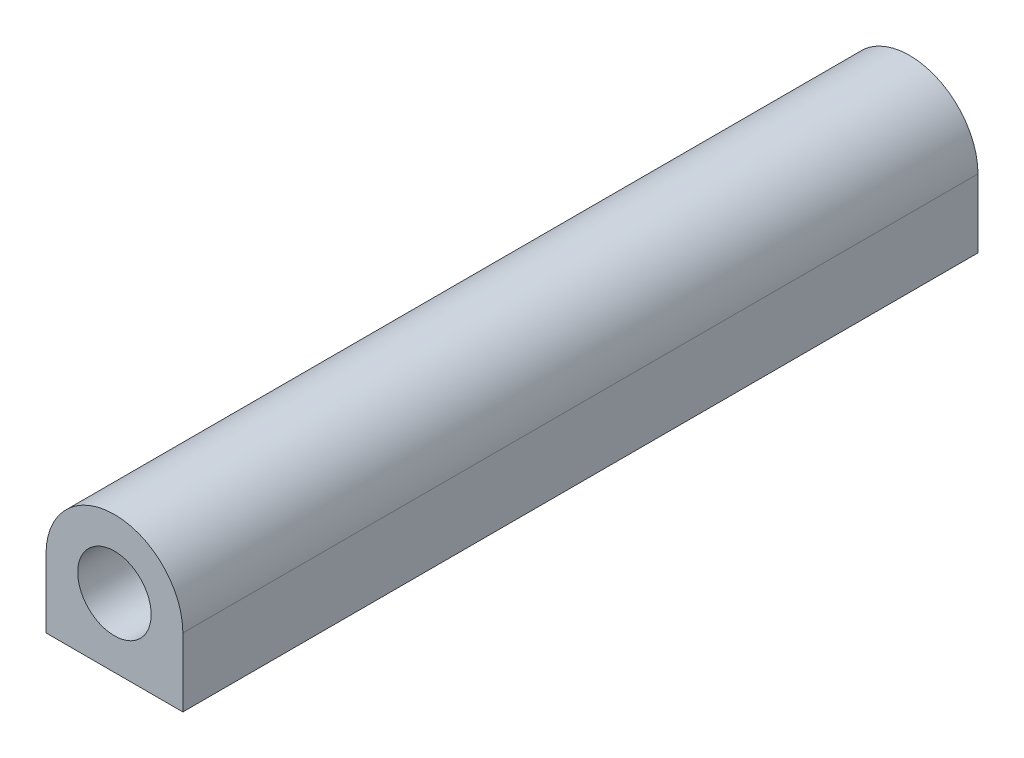
ISO-10303-21;
HEADER;
FILE_DESCRIPTION(('STEP AP214'),'2;1');
FILE_NAME('part.step','',(''),(''),'','','');
FILE_SCHEMA(('AUTOMOTIVE_DESIGN { 1 0 10303 214 1 1 1 1 }'));
ENDSEC;
DATA;
#1=APPLICATION_CONTEXT('core data for automotive mechanical design processes');
#2=APPLICATION_PROTOCOL_DEFINITION('international standard','automotive_design',2000,#1);
#3=PRODUCT_CONTEXT('',#1,'mechanical');
#4=PRODUCT('Part','Part','',(#3));
#5=PRODUCT_RELATED_PRODUCT_CATEGORY('part','',(#4));
#6=PRODUCT_DEFINITION_FORMATION('','',#4);
#7=PRODUCT_DEFINITION_CONTEXT('part definition',#1,'design');
#8=PRODUCT_DEFINITION('design','',#6,#7);
#9=PRODUCT_DEFINITION_SHAPE('','',#8);
#10=(LENGTH_UNIT() NAMED_UNIT(*) SI_UNIT(.MILLI.,.METRE.));
#11=(NAMED_UNIT(*) PLANE_ANGLE_UNIT() SI_UNIT($,.RADIAN.));
#12=(NAMED_UNIT(*) SI_UNIT($,.STERADIAN.) SOLID_ANGLE_UNIT());
#13=UNCERTAINTY_MEASURE_WITH_UNIT(LENGTH_MEASURE(1.E-05),#10,'distance_accuracy_value','');
#14=(GEOMETRIC_REPRESENTATION_CONTEXT(3) GLOBAL_UNCERTAINTY_ASSIGNED_CONTEXT((#13)) GLOBAL_UNIT_ASSIGNED_CONTEXT((#10,
#11,#12)) REPRESENTATION_CONTEXT('',''));
#15=CARTESIAN_POINT('',(0.,0.,0.));
#16=DIRECTION('',(0.,0.,1.));
#17=DIRECTION('',(1.,0.,0.));
#18=AXIS2_PLACEMENT_3D('',#15,#16,#17);
#19=CARTESIAN_POINT('',(0.,0.,31.95));
#20=DIRECTION('',(0.,0.,-1.));
#21=DIRECTION('',(-1.,0.,0.));
#22=AXIS2_PLACEMENT_3D('',#19,#20,#21);
#23=CYLINDRICAL_SURFACE('',#22,2.75);
#24=CARTESIAN_POINT('',(0.,0.,31.95));
#25=DIRECTION('',(0.,0.,1.));
#26=DIRECTION('',(1.,0.,0.));
#27=AXIS2_PLACEMENT_3D('',#24,#25,#26);
#28=CIRCLE('',#27,2.75);
#29=CARTESIAN_POINT('',(2.75,0.,31.95));
#30=VERTEX_POINT('',#29);
#31=CARTESIAN_POINT('',(-2.75,0.,31.95));
#32=VERTEX_POINT('',#31);
#33=EDGE_CURVE('E12',#30,#32,#28,.T.);
#34=ORIENTED_EDGE('',*,*,#33,.F.);
#35=DIRECTION('',(0.,0.,1.));
#36=VECTOR('',#35,1.);
#37=CARTESIAN_POINT('',(2.75,0.,-3.88908729652601));
#38=LINE('',#37,#36);
#39=CARTESIAN_POINT('',(2.75,0.,0.));
#40=VERTEX_POINT('',#39);
#41=EDGE_CURVE('E100',#40,#30,#38,.T.);
#42=ORIENTED_EDGE('',*,*,#41,.F.);
#43=CARTESIAN_POINT('',(0.,0.,0.));
#44=DIRECTION('',(0.,0.,1.));
#45=DIRECTION('',(1.,0.,0.));
#46=AXIS2_PLACEMENT_3D('',#43,#44,#45);
#47=CIRCLE('',#46,2.75);
#48=CARTESIAN_POINT('',(-2.75,0.,0.));
#49=VERTEX_POINT('',#48);
#50=EDGE_CURVE('E60',#40,#49,#47,.T.);
#51=ORIENTED_EDGE('',*,*,#50,.T.);
#52=DIRECTION('',(0.,0.,1.));
#53=VECTOR('',#52,1.);
#54=CARTESIAN_POINT('',(-2.75,0.,-3.88908729652601));
#55=LINE('',#54,#53);
#56=EDGE_CURVE('E113',#49,#32,#55,.T.);
#57=ORIENTED_EDGE('',*,*,#56,.T.);
#58=EDGE_LOOP('',(#34,#42,#51,#57));
#59=FACE_BOUND('',#58,.T.);
#60=ADVANCED_FACE('F57',(#59),#23,.T.);
#61=CARTESIAN_POINT('',(0.,0.,31.95));
#62=DIRECTION('',(0.,0.,1.));
#63=DIRECTION('',(1.,0.,0.));
#64=AXIS2_PLACEMENT_3D('',#61,#62,#63);
#65=PLANE('',#64);
#66=CARTESIAN_POINT('',(0.,0.,31.95));
#67=DIRECTION('',(0.,0.,1.));
#68=DIRECTION('',(1.,0.,0.));
#69=AXIS2_PLACEMENT_3D('',#66,#67,#68);
#70=CIRCLE('',#69,1.475);
#71=CARTESIAN_POINT('',(1.475,0.,31.95));
#72=VERTEX_POINT('',#71);
#73=EDGE_CURVE('E132',#72,#72,#70,.T.);
#74=ORIENTED_EDGE('',*,*,#73,.F.);
#75=EDGE_LOOP('',(#74));
#76=FACE_BOUND('',#75,.T.);
#77=DIRECTION('',(1.,0.,0.));
#78=VECTOR('',#77,1.);
#79=CARTESIAN_POINT('',(0.,-2.75,31.95));
#80=LINE('',#79,#78);
#81=CARTESIAN_POINT('',(-2.75,-2.75,31.95));
#82=VERTEX_POINT('',#81);
#83=CARTESIAN_POINT('',(2.75,-2.75,31.95));
#84=VERTEX_POINT('',#83);
#85=EDGE_CURVE('E118',#82,#84,#80,.T.);
#86=ORIENTED_EDGE('',*,*,#85,.T.);
#87=DIRECTION('',(0.,-1.,0.));
#88=VECTOR('',#87,1.);
#89=CARTESIAN_POINT('',(2.75,0.,31.95));
#90=LINE('',#89,#88);
#91=EDGE_CURVE('E105',#30,#84,#90,.T.);
#92=ORIENTED_EDGE('',*,*,#91,.F.);
#93=ORIENTED_EDGE('',*,*,#33,.T.);
#94=DIRECTION('',(0.,-1.,0.));
#95=VECTOR('',#94,1.);
#96=CARTESIAN_POINT('',(-2.75,0.,31.95));
#97=LINE('',#96,#95);
#98=EDGE_CURVE('E121',#32,#82,#97,.T.);
#99=ORIENTED_EDGE('',*,*,#98,.T.);
#100=EDGE_LOOP('',(#86,#92,#93,#99));
#101=FACE_BOUND('',#100,.T.);
#102=ADVANCED_FACE('F147',(#76,#101),#65,.T.);
#103=CARTESIAN_POINT('',(0.,0.,0.));
#104=DIRECTION('',(0.,0.,1.));
#105=DIRECTION('',(1.,0.,0.));
#106=AXIS2_PLACEMENT_3D('',#103,#104,#105);
#107=PLANE('',#106);
#108=CARTESIAN_POINT('',(0.,0.,0.));
#109=DIRECTION('',(0.,0.,-1.));
#110=DIRECTION('',(-1.,0.,0.));
#111=AXIS2_PLACEMENT_3D('',#108,#109,#110);
#112=CIRCLE('',#111,1.475);
#113=CARTESIAN_POINT('',(-1.475,0.,0.));
#114=VERTEX_POINT('',#113);
#115=EDGE_CURVE('E126',#114,#114,#112,.T.);
#116=ORIENTED_EDGE('',*,*,#115,.F.);
#117=EDGE_LOOP('',(#116));
#118=FACE_BOUND('',#117,.T.);
#119=ORIENTED_EDGE('',*,*,#50,.F.);
#120=DIRECTION('',(0.,1.,0.));
#121=VECTOR('',#120,1.);
#122=CARTESIAN_POINT('',(2.75,0.,0.));
#123=LINE('',#122,#121);
#124=CARTESIAN_POINT('',(2.75,-2.75,0.));
#125=VERTEX_POINT('',#124);
#126=EDGE_CURVE('E97',#125,#40,#123,.T.);
#127=ORIENTED_EDGE('',*,*,#126,.F.);
#128=DIRECTION('',(-1.,0.,0.));
#129=VECTOR('',#128,1.);
#130=CARTESIAN_POINT('',(0.,-2.75,0.));
#131=LINE('',#130,#129);
#132=CARTESIAN_POINT('',(-2.75,-2.75,0.));
#133=VERTEX_POINT('',#132);
#134=EDGE_CURVE('E111',#125,#133,#131,.T.);
#135=ORIENTED_EDGE('',*,*,#134,.T.);
#136=DIRECTION('',(0.,1.,0.));
#137=VECTOR('',#136,1.);
#138=CARTESIAN_POINT('',(-2.75,0.,0.));
#139=LINE('',#138,#137);
#140=EDGE_CURVE('E109',#133,#49,#139,.T.);
#141=ORIENTED_EDGE('',*,*,#140,.T.);
#142=EDGE_LOOP('',(#119,#127,#135,#141));
#143=FACE_BOUND('',#142,.T.);
#144=ADVANCED_FACE('F107',(#118,#143),#107,.F.);
#145=CARTESIAN_POINT('',(-2.75,0.,-3.88908729652601));
#146=DIRECTION('',(-1.,0.,0.));
#147=DIRECTION('',(0.,0.,1.));
#148=AXIS2_PLACEMENT_3D('',#145,#146,#147);
#149=PLANE('',#148);
#150=ORIENTED_EDGE('',*,*,#140,.F.);
#151=DIRECTION('',(0.,0.,1.));
#152=VECTOR('',#151,1.);
#153=CARTESIAN_POINT('',(-2.75,-2.75,-3.88908729652601));
#154=LINE('',#153,#152);
#155=EDGE_CURVE('E116',#133,#82,#154,.T.);
#156=ORIENTED_EDGE('',*,*,#155,.T.);
#157=ORIENTED_EDGE('',*,*,#98,.F.);
#158=ORIENTED_EDGE('',*,*,#56,.F.);
#159=EDGE_LOOP('',(#150,#156,#157,#158));
#160=FACE_BOUND('',#159,.T.);
#161=ADVANCED_FACE('F156',(#160),#149,.T.);
#162=CARTESIAN_POINT('',(0.,-2.75,-3.88908729652601));
#163=DIRECTION('',(0.,-1.,0.));
#164=DIRECTION('',(0.,0.,-1.));
#165=AXIS2_PLACEMENT_3D('',#162,#163,#164);
#166=PLANE('',#165);
#167=ORIENTED_EDGE('',*,*,#134,.F.);
#168=DIRECTION('',(0.,0.,1.));
#169=VECTOR('',#168,1.);
#170=CARTESIAN_POINT('',(2.75,-2.75,-3.88908729652601));
#171=LINE('',#170,#169);
#172=EDGE_CURVE('E102',#125,#84,#171,.T.);
#173=ORIENTED_EDGE('',*,*,#172,.T.);
#174=ORIENTED_EDGE('',*,*,#85,.F.);
#175=ORIENTED_EDGE('',*,*,#155,.F.);
#176=EDGE_LOOP('',(#167,#173,#174,#175));
#177=FACE_BOUND('',#176,.T.);
#178=ADVANCED_FACE('F154',(#177),#166,.T.);
#179=CARTESIAN_POINT('',(2.75,0.,-3.88908729652601));
#180=DIRECTION('',(-1.,0.,0.));
#181=DIRECTION('',(0.,0.,1.));
#182=AXIS2_PLACEMENT_3D('',#179,#180,#181);
#183=PLANE('',#182);
#184=ORIENTED_EDGE('',*,*,#172,.F.);
#185=ORIENTED_EDGE('',*,*,#126,.T.);
#186=ORIENTED_EDGE('',*,*,#41,.T.);
#187=ORIENTED_EDGE('',*,*,#91,.T.);
#188=EDGE_LOOP('',(#184,#185,#186,#187));
#189=FACE_BOUND('',#188,.T.);
#190=ADVANCED_FACE('F98',(#189),#183,.F.);
#191=CARTESIAN_POINT('',(0.,0.,10.));
#192=DIRECTION('',(0.,0.,-1.));
#193=DIRECTION('',(-1.,0.,0.));
#194=AXIS2_PLACEMENT_3D('',#191,#192,#193);
#195=CYLINDRICAL_SURFACE('',#194,1.475);
#196=CARTESIAN_POINT('',(0.,0.,10.));
#197=DIRECTION('',(0.,0.,-1.));
#198=DIRECTION('',(-1.,0.,0.));
#199=AXIS2_PLACEMENT_3D('',#196,#197,#198);
#200=CIRCLE('',#199,1.475);
#201=CARTESIAN_POINT('',(-1.475,0.,10.));
#202=VERTEX_POINT('',#201);
#203=EDGE_CURVE('E124',#202,#202,#200,.T.);
#204=ORIENTED_EDGE('',*,*,#203,.F.);
#205=EDGE_LOOP('',(#204));
#206=FACE_BOUND('',#205,.T.);
#207=ORIENTED_EDGE('',*,*,#115,.T.);
#208=EDGE_LOOP('',(#207));
#209=FACE_BOUND('',#208,.T.);
#210=ADVANCED_FACE('F191',(#206,#209),#195,.F.);
#211=CARTESIAN_POINT('',(0.,0.,10.));
#212=DIRECTION('',(0.,0.,-1.));
#213=DIRECTION('',(-1.,0.,0.));
#214=AXIS2_PLACEMENT_3D('',#211,#212,#213);
#215=PLANE('',#214);
#216=ORIENTED_EDGE('',*,*,#203,.T.);
#217=EDGE_LOOP('',(#216));
#218=FACE_BOUND('',#217,.T.);
#219=ADVANCED_FACE('F143',(#218),#215,.T.);
#220=CARTESIAN_POINT('',(0.,0.,21.95));
#221=DIRECTION('',(0.,0.,1.));
#222=DIRECTION('',(1.,0.,0.));
#223=AXIS2_PLACEMENT_3D('',#220,#221,#222);
#224=CYLINDRICAL_SURFACE('',#223,1.475);
#225=CARTESIAN_POINT('',(0.,0.,21.95));
#226=DIRECTION('',(0.,0.,1.));
#227=DIRECTION('',(1.,0.,0.));
#228=AXIS2_PLACEMENT_3D('',#225,#226,#227);
#229=CIRCLE('',#228,1.475);
#230=CARTESIAN_POINT('',(1.475,0.,21.95));
#231=VERTEX_POINT('',#230);
#232=EDGE_CURVE('E129',#231,#231,#229,.T.);
#233=ORIENTED_EDGE('',*,*,#232,.F.);
#234=EDGE_LOOP('',(#233));
#235=FACE_BOUND('',#234,.T.);
#236=ORIENTED_EDGE('',*,*,#73,.T.);
#237=EDGE_LOOP('',(#236));
#238=FACE_BOUND('',#237,.T.);
#239=ADVANCED_FACE('F140',(#235,#238),#224,.F.);
#240=CARTESIAN_POINT('',(0.,0.,21.95));
#241=DIRECTION('',(0.,0.,1.));
#242=DIRECTION('',(1.,0.,0.));
#243=AXIS2_PLACEMENT_3D('',#240,#241,#242);
#244=PLANE('',#243);
#245=ORIENTED_EDGE('',*,*,#232,.T.);
#246=EDGE_LOOP('',(#245));
#247=FACE_BOUND('',#246,.T.);
#248=ADVANCED_FACE('F138',(#247),#244,.T.);
#249=CLOSED_SHELL('',(#60,#102,#144,#161,#178,#190,#210,#219,#239,#248));
#250=MANIFOLD_SOLID_BREP('B2',#249);
#251=ADVANCED_BREP_SHAPE_REPRESENTATION('',(#18,#250),#14);
#252=SHAPE_DEFINITION_REPRESENTATION(#9,#251);
ENDSEC;
END-ISO-10303-21;
